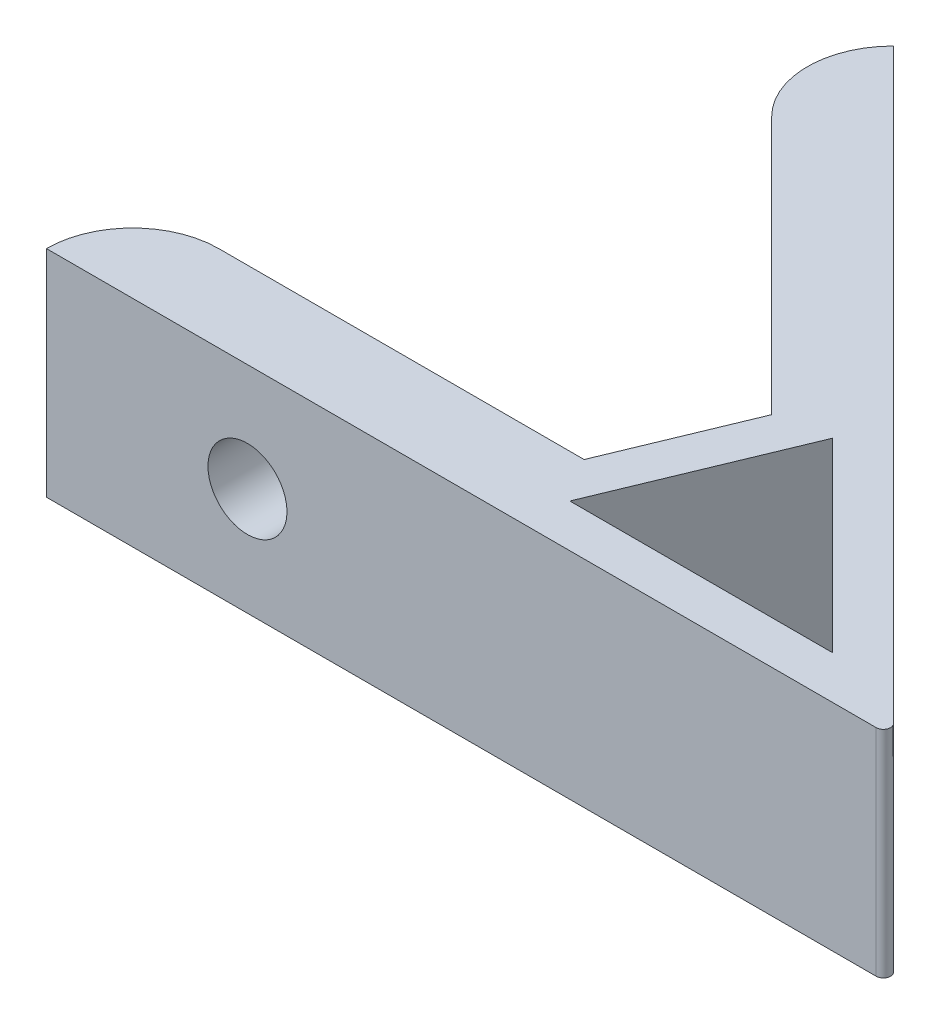
ISO-10303-21;
HEADER;
FILE_DESCRIPTION(('STEP AP214'),'2;1');
FILE_NAME('part.step','',(''),(''),'','','');
FILE_SCHEMA(('AUTOMOTIVE_DESIGN { 1 0 10303 214 1 1 1 1 }'));
ENDSEC;
DATA;
#1=APPLICATION_CONTEXT('core data for automotive mechanical design processes');
#2=APPLICATION_PROTOCOL_DEFINITION('international standard','automotive_design',2000,#1);
#3=PRODUCT_CONTEXT('',#1,'mechanical');
#4=PRODUCT('Part','Part','',(#3));
#5=PRODUCT_RELATED_PRODUCT_CATEGORY('part','',(#4));
#6=PRODUCT_DEFINITION_FORMATION('','',#4);
#7=PRODUCT_DEFINITION_CONTEXT('part definition',#1,'design');
#8=PRODUCT_DEFINITION('design','',#6,#7);
#9=PRODUCT_DEFINITION_SHAPE('','',#8);
#10=(LENGTH_UNIT() NAMED_UNIT(*) SI_UNIT(.MILLI.,.METRE.));
#11=(NAMED_UNIT(*) PLANE_ANGLE_UNIT() SI_UNIT($,.RADIAN.));
#12=(NAMED_UNIT(*) SI_UNIT($,.STERADIAN.) SOLID_ANGLE_UNIT());
#13=UNCERTAINTY_MEASURE_WITH_UNIT(LENGTH_MEASURE(1.E-05),#10,'distance_accuracy_value','');
#14=(GEOMETRIC_REPRESENTATION_CONTEXT(3) GLOBAL_UNCERTAINTY_ASSIGNED_CONTEXT((#13)) GLOBAL_UNIT_ASSIGNED_CONTEXT((#10,
#11,#12)) REPRESENTATION_CONTEXT('',''));
#15=CARTESIAN_POINT('',(0.,0.,0.));
#16=DIRECTION('',(0.,0.,1.));
#17=DIRECTION('',(1.,0.,0.));
#18=AXIS2_PLACEMENT_3D('',#15,#16,#17);
#19=CARTESIAN_POINT('',(0.,15.,0.));
#20=DIRECTION('',(-0.707106781186549,0.,0.707106781186546));
#21=DIRECTION('',(0.707106781186546,0.,0.707106781186549));
#22=AXIS2_PLACEMENT_3D('',#19,#20,#21);
#23=PLANE('',#22);
#24=CARTESIAN_POINT('',(-31.8198051533946,7.5,-31.8198051533947));
#25=DIRECTION('',(-0.707106781186549,0.,0.707106781186546));
#26=DIRECTION('',(0.707106781186546,0.,0.707106781186549));
#27=AXIS2_PLACEMENT_3D('',#24,#25,#26);
#28=CIRCLE('',#27,2.75);
#29=CARTESIAN_POINT('',(-29.8752615051316,7.5,-29.8752615051317));
#30=VERTEX_POINT('',#29);
#31=EDGE_CURVE('E438',#30,#30,#28,.T.);
#32=ORIENTED_EDGE('',*,*,#31,.T.);
#33=EDGE_LOOP('',(#32));
#34=FACE_BOUND('',#33,.T.);
#35=DIRECTION('',(-0.707106781186546,0.,-0.707106781186549));
#36=VECTOR('',#35,1.);
#37=CARTESIAN_POINT('',(0.,15.,0.));
#38=LINE('',#37,#36);
#39=CARTESIAN_POINT('',(-0.853553390593271,15.,-0.853553390593273));
#40=VERTEX_POINT('',#39);
#41=CARTESIAN_POINT('',(-41.7193000900062,15.,-41.7193000900064));
#42=VERTEX_POINT('',#41);
#43=EDGE_CURVE('E153',#40,#42,#38,.T.);
#44=ORIENTED_EDGE('',*,*,#43,.F.);
#45=DIRECTION('',(0.,-1.,0.));
#46=VECTOR('',#45,1.);
#47=CARTESIAN_POINT('',(-0.853553390593271,15.,-0.853553390593273));
#48=LINE('',#47,#46);
#49=CARTESIAN_POINT('',(-0.853553390593271,0.,-0.853553390593273));
#50=VERTEX_POINT('',#49);
#51=EDGE_CURVE('E202',#40,#50,#48,.T.);
#52=ORIENTED_EDGE('',*,*,#51,.T.);
#53=DIRECTION('',(-0.707106781186546,0.,-0.707106781186549));
#54=VECTOR('',#53,1.);
#55=CARTESIAN_POINT('',(0.,0.,0.));
#56=LINE('',#55,#54);
#57=CARTESIAN_POINT('',(-41.7193000900062,0.,-41.7193000900064));
#58=VERTEX_POINT('',#57);
#59=EDGE_CURVE('E151',#50,#58,#56,.T.);
#60=ORIENTED_EDGE('',*,*,#59,.T.);
#61=DIRECTION('',(0.,-1.,0.));
#62=VECTOR('',#61,1.);
#63=CARTESIAN_POINT('',(-41.7193000900062,15.,-41.7193000900064));
#64=LINE('',#63,#62);
#65=EDGE_CURVE('E185',#42,#58,#64,.T.);
#66=ORIENTED_EDGE('',*,*,#65,.F.);
#67=EDGE_LOOP('',(#44,#52,#60,#66));
#68=FACE_BOUND('',#67,.T.);
#69=ADVANCED_FACE('F39',(#34,#68),#23,.F.);
#70=CARTESIAN_POINT('',(-45.9619407771255,15.,-37.4766594028871));
#71=DIRECTION('',(0.707106781186549,0.,-0.707106781186546));
#72=DIRECTION('',(-0.707106781186546,0.,-0.707106781186549));
#73=AXIS2_PLACEMENT_3D('',#70,#71,#72);
#74=PLANE('',#73);
#75=CARTESIAN_POINT('',(-36.0624458405139,7.5,-27.5771644662754));
#76=DIRECTION('',(-0.707106781186549,0.,0.707106781186546));
#77=DIRECTION('',(0.707106781186546,0.,0.707106781186549));
#78=AXIS2_PLACEMENT_3D('',#75,#76,#77);
#79=CIRCLE('',#78,2.75);
#80=CARTESIAN_POINT('',(-34.1179021922509,7.5,-25.6326208180124));
#81=VERTEX_POINT('',#80);
#82=EDGE_CURVE('E436',#81,#81,#79,.T.);
#83=ORIENTED_EDGE('',*,*,#82,.F.);
#84=EDGE_LOOP('',(#83));
#85=FACE_BOUND('',#84,.T.);
#86=DIRECTION('',(0.707106781186546,0.,0.707106781186549));
#87=VECTOR('',#86,1.);
#88=CARTESIAN_POINT('',(-45.9619407771255,15.,-37.4766594028871));
#89=LINE('',#88,#87);
#90=CARTESIAN_POINT('',(-41.7193000900062,15.,-33.2340187157678));
#91=VERTEX_POINT('',#90);
#92=CARTESIAN_POINT('',(-23.7240766993514,15.,-15.2387953251129));
#93=VERTEX_POINT('',#92);
#94=EDGE_CURVE('E155',#91,#93,#89,.T.);
#95=ORIENTED_EDGE('',*,*,#94,.F.);
#96=DIRECTION('',(0.,-1.,0.));
#97=VECTOR('',#96,1.);
#98=CARTESIAN_POINT('',(-41.7193000900062,15.,-33.2340187157678));
#99=LINE('',#98,#97);
#100=CARTESIAN_POINT('',(-41.7193000900062,0.,-33.2340187157678));
#101=VERTEX_POINT('',#100);
#102=EDGE_CURVE('E188',#91,#101,#99,.T.);
#103=ORIENTED_EDGE('',*,*,#102,.T.);
#104=DIRECTION('',(0.707106781186546,0.,0.707106781186549));
#105=VECTOR('',#104,1.);
#106=CARTESIAN_POINT('',(-45.9619407771255,0.,-37.4766594028871));
#107=LINE('',#106,#105);
#108=CARTESIAN_POINT('',(-23.7240766993514,0.,-15.2387953251129));
#109=VERTEX_POINT('',#108);
#110=EDGE_CURVE('E168',#101,#109,#107,.T.);
#111=ORIENTED_EDGE('',*,*,#110,.T.);
#112=DIRECTION('',(0.,-1.,0.));
#113=VECTOR('',#112,1.);
#114=CARTESIAN_POINT('',(-23.7240766993514,15.,-15.2387953251129));
#115=LINE('',#114,#113);
#116=EDGE_CURVE('E182',#93,#109,#115,.T.);
#117=ORIENTED_EDGE('',*,*,#116,.F.);
#118=EDGE_LOOP('',(#95,#103,#111,#117));
#119=FACE_BOUND('',#118,.T.);
#120=ADVANCED_FACE('F231',(#85,#119),#74,.F.);
#121=CARTESIAN_POINT('',(-23.7240766993514,15.,-15.2387953251129));
#122=DIRECTION('',(0.92387953251129,0.,0.382683432365081));
#123=DIRECTION('',(0.382683432365081,0.,-0.92387953251129));
#124=AXIS2_PLACEMENT_3D('',#121,#122,#123);
#125=PLANE('',#124);
#126=DIRECTION('',(-0.382683432365081,0.,0.92387953251129));
#127=VECTOR('',#126,1.);
#128=CARTESIAN_POINT('',(-23.7240766993514,0.,-15.2387953251129));
#129=LINE('',#128,#127);
#130=CARTESIAN_POINT('',(-27.5509110230022,0.,-6.));
#131=VERTEX_POINT('',#130);
#132=EDGE_CURVE('E170',#109,#131,#129,.T.);
#133=ORIENTED_EDGE('',*,*,#132,.T.);
#134=DIRECTION('',(0.,-1.,0.));
#135=VECTOR('',#134,1.);
#136=CARTESIAN_POINT('',(-27.5509110230022,15.,-6.));
#137=LINE('',#136,#135);
#138=CARTESIAN_POINT('',(-27.5509110230022,15.,-6.));
#139=VERTEX_POINT('',#138);
#140=EDGE_CURVE('E179',#139,#131,#137,.T.);
#141=ORIENTED_EDGE('',*,*,#140,.F.);
#142=DIRECTION('',(-0.382683432365081,0.,0.92387953251129));
#143=VECTOR('',#142,1.);
#144=CARTESIAN_POINT('',(-23.7240766993514,15.,-15.2387953251129));
#145=LINE('',#144,#143);
#146=EDGE_CURVE('E158',#93,#139,#145,.T.);
#147=ORIENTED_EDGE('',*,*,#146,.F.);
#148=ORIENTED_EDGE('',*,*,#116,.T.);
#149=EDGE_LOOP('',(#133,#141,#147,#148));
#150=FACE_BOUND('',#149,.T.);
#151=ADVANCED_FACE('F235',(#150),#125,.F.);
#152=CARTESIAN_POINT('',(-27.5509110230022,15.,-6.));
#153=DIRECTION('',(0.,0.,1.));
#154=DIRECTION('',(1.,0.,0.));
#155=AXIS2_PLACEMENT_3D('',#152,#153,#154);
#156=PLANE('',#155);
#157=CARTESIAN_POINT('',(-45.,7.5,-5.99999999999999));
#158=DIRECTION('',(0.,0.,-1.));
#159=DIRECTION('',(-1.,0.,0.));
#160=AXIS2_PLACEMENT_3D('',#157,#158,#159);
#161=CIRCLE('',#160,2.75);
#162=CARTESIAN_POINT('',(-47.75,7.5,-5.99999999999999));
#163=VERTEX_POINT('',#162);
#164=EDGE_CURVE('E142',#163,#163,#161,.T.);
#165=ORIENTED_EDGE('',*,*,#164,.F.);
#166=EDGE_LOOP('',(#165));
#167=FACE_BOUND('',#166,.T.);
#168=DIRECTION('',(-1.,0.,0.));
#169=VECTOR('',#168,1.);
#170=CARTESIAN_POINT('',(-27.5509110230022,0.,-6.));
#171=LINE('',#170,#169);
#172=CARTESIAN_POINT('',(-53.,0.,-5.99999999999999));
#173=VERTEX_POINT('',#172);
#174=EDGE_CURVE('E172',#131,#173,#171,.T.);
#175=ORIENTED_EDGE('',*,*,#174,.T.);
#176=DIRECTION('',(0.,-1.,0.));
#177=VECTOR('',#176,1.);
#178=CARTESIAN_POINT('',(-53.,15.,-5.99999999999999));
#179=LINE('',#178,#177);
#180=CARTESIAN_POINT('',(-53.,15.,-5.99999999999999));
#181=VERTEX_POINT('',#180);
#182=EDGE_CURVE('E200',#173,#181,#179,.F.);
#183=ORIENTED_EDGE('',*,*,#182,.T.);
#184=DIRECTION('',(-1.,0.,0.));
#185=VECTOR('',#184,1.);
#186=CARTESIAN_POINT('',(-27.5509110230022,15.,-6.));
#187=LINE('',#186,#185);
#188=EDGE_CURVE('E160',#139,#181,#187,.T.);
#189=ORIENTED_EDGE('',*,*,#188,.F.);
#190=ORIENTED_EDGE('',*,*,#140,.T.);
#191=EDGE_LOOP('',(#175,#183,#189,#190));
#192=FACE_BOUND('',#191,.T.);
#193=ADVANCED_FACE('F242',(#167,#192),#156,.F.);
#194=CARTESIAN_POINT('',(0.,15.,0.));
#195=DIRECTION('',(0.,0.,-1.));
#196=DIRECTION('',(-1.,0.,0.));
#197=AXIS2_PLACEMENT_3D('',#194,#195,#196);
#198=PLANE('',#197);
#199=CARTESIAN_POINT('',(-45.,7.5,0.));
#200=DIRECTION('',(0.,0.,-1.));
#201=DIRECTION('',(-1.,0.,0.));
#202=AXIS2_PLACEMENT_3D('',#199,#200,#201);
#203=CIRCLE('',#202,2.75);
#204=CARTESIAN_POINT('',(-47.75,7.5,0.));
#205=VERTEX_POINT('',#204);
#206=EDGE_CURVE('E147',#205,#205,#203,.T.);
#207=ORIENTED_EDGE('',*,*,#206,.T.);
#208=EDGE_LOOP('',(#207));
#209=FACE_BOUND('',#208,.T.);
#210=DIRECTION('',(1.,0.,0.));
#211=VECTOR('',#210,1.);
#212=CARTESIAN_POINT('',(0.,0.,0.));
#213=LINE('',#212,#211);
#214=CARTESIAN_POINT('',(-59.,0.,0.));
#215=VERTEX_POINT('',#214);
#216=CARTESIAN_POINT('',(-1.20710678118655,0.,0.));
#217=VERTEX_POINT('',#216);
#218=EDGE_CURVE('E156',#215,#217,#213,.T.);
#219=ORIENTED_EDGE('',*,*,#218,.T.);
#220=DIRECTION('',(0.,-1.,0.));
#221=VECTOR('',#220,1.);
#222=CARTESIAN_POINT('',(-1.20710678118655,15.,0.));
#223=LINE('',#222,#221);
#224=CARTESIAN_POINT('',(-1.20710678118655,15.,0.));
#225=VERTEX_POINT('',#224);
#226=EDGE_CURVE('E47',#217,#225,#223,.F.);
#227=ORIENTED_EDGE('',*,*,#226,.T.);
#228=DIRECTION('',(1.,0.,0.));
#229=VECTOR('',#228,1.);
#230=CARTESIAN_POINT('',(0.,15.,0.));
#231=LINE('',#230,#229);
#232=CARTESIAN_POINT('',(-59.,15.,0.));
#233=VERTEX_POINT('',#232);
#234=EDGE_CURVE('E163',#233,#225,#231,.T.);
#235=ORIENTED_EDGE('',*,*,#234,.F.);
#236=DIRECTION('',(0.,-1.,0.));
#237=VECTOR('',#236,1.);
#238=CARTESIAN_POINT('',(-59.,15.,0.));
#239=LINE('',#238,#237);
#240=EDGE_CURVE('E166',#233,#215,#239,.T.);
#241=ORIENTED_EDGE('',*,*,#240,.T.);
#242=EDGE_LOOP('',(#219,#227,#235,#241));
#243=FACE_BOUND('',#242,.T.);
#244=ADVANCED_FACE('F209',(#209,#243),#198,.F.);
#245=CARTESIAN_POINT('',(0.,15.,0.));
#246=DIRECTION('',(0.,1.,0.));
#247=DIRECTION('',(0.,0.,1.));
#248=AXIS2_PLACEMENT_3D('',#245,#246,#247);
#249=PLANE('',#248);
#250=DIRECTION('',(-0.382683432365081,0.,0.92387953251129));
#251=VECTOR('',#250,1.);
#252=CARTESIAN_POINT('',(-25.5463751092443,15.,-3.));
#253=LINE('',#252,#251);
#254=CARTESIAN_POINT('',(-20.1853354180416,15.,-15.9426947309223));
#255=VERTEX_POINT('',#254);
#256=CARTESIAN_POINT('',(-25.5463751092443,15.,-3.));
#257=VERTEX_POINT('',#256);
#258=EDGE_CURVE('E54',#255,#257,#253,.T.);
#259=ORIENTED_EDGE('',*,*,#258,.F.);
#260=DIRECTION('',(-0.707106781186548,0.,-0.707106781186547));
#261=VECTOR('',#260,1.);
#262=CARTESIAN_POINT('',(-20.1853354180416,15.,-15.9426947309223));
#263=LINE('',#262,#261);
#264=CARTESIAN_POINT('',(-7.24264068711928,15.,-3.));
#265=VERTEX_POINT('',#264);
#266=EDGE_CURVE('E136',#265,#255,#263,.T.);
#267=ORIENTED_EDGE('',*,*,#266,.F.);
#268=DIRECTION('',(1.,0.,0.));
#269=VECTOR('',#268,1.);
#270=CARTESIAN_POINT('',(-7.24264068711928,15.,-3.));
#271=LINE('',#270,#269);
#272=EDGE_CURVE('E139',#257,#265,#271,.T.);
#273=ORIENTED_EDGE('',*,*,#272,.F.);
#274=EDGE_LOOP('',(#259,#267,#273));
#275=FACE_BOUND('',#274,.T.);
#276=ORIENTED_EDGE('',*,*,#234,.T.);
#277=CARTESIAN_POINT('',(-1.20710678118655,15.,-0.5));
#278=DIRECTION('',(0.,1.,0.));
#279=DIRECTION('',(0.,0.,1.));
#280=AXIS2_PLACEMENT_3D('',#277,#278,#279);
#281=CIRCLE('',#280,0.5);
#282=EDGE_CURVE('E11',#225,#40,#281,.T.);
#283=ORIENTED_EDGE('',*,*,#282,.T.);
#284=ORIENTED_EDGE('',*,*,#43,.T.);
#285=CARTESIAN_POINT('',(-37.476659402887,15.,-37.4766594028871));
#286=DIRECTION('',(0.,1.,0.));
#287=DIRECTION('',(0.,0.,1.));
#288=AXIS2_PLACEMENT_3D('',#285,#286,#287);
#289=CIRCLE('',#288,6.);
#290=EDGE_CURVE('E198',#42,#91,#289,.T.);
#291=ORIENTED_EDGE('',*,*,#290,.T.);
#292=ORIENTED_EDGE('',*,*,#94,.T.);
#293=ORIENTED_EDGE('',*,*,#146,.T.);
#294=ORIENTED_EDGE('',*,*,#188,.T.);
#295=CARTESIAN_POINT('',(-53.,15.,0.));
#296=DIRECTION('',(0.,1.,0.));
#297=DIRECTION('',(0.,0.,1.));
#298=AXIS2_PLACEMENT_3D('',#295,#296,#297);
#299=CIRCLE('',#298,6.);
#300=EDGE_CURVE('E196',#181,#233,#299,.T.);
#301=ORIENTED_EDGE('',*,*,#300,.T.);
#302=EDGE_LOOP('',(#276,#283,#284,#291,#292,#293,#294,#301));
#303=FACE_BOUND('',#302,.T.);
#304=ADVANCED_FACE('F215',(#275,#303),#249,.T.);
#305=CARTESIAN_POINT('',(0.,0.,0.));
#306=DIRECTION('',(0.,1.,0.));
#307=DIRECTION('',(0.,0.,1.));
#308=AXIS2_PLACEMENT_3D('',#305,#306,#307);
#309=PLANE('',#308);
#310=DIRECTION('',(-0.707106781186548,0.,-0.707106781186547));
#311=VECTOR('',#310,1.);
#312=CARTESIAN_POINT('',(-20.1853354180416,0.,-15.9426947309223));
#313=LINE('',#312,#311);
#314=CARTESIAN_POINT('',(-7.24264068711928,0.,-3.));
#315=VERTEX_POINT('',#314);
#316=CARTESIAN_POINT('',(-20.1853354180416,0.,-15.9426947309223));
#317=VERTEX_POINT('',#316);
#318=EDGE_CURVE('E62',#315,#317,#313,.T.);
#319=ORIENTED_EDGE('',*,*,#318,.T.);
#320=DIRECTION('',(-0.382683432365081,0.,0.92387953251129));
#321=VECTOR('',#320,1.);
#322=CARTESIAN_POINT('',(-25.5463751092443,0.,-3.));
#323=LINE('',#322,#321);
#324=CARTESIAN_POINT('',(-25.5463751092443,0.,-3.));
#325=VERTEX_POINT('',#324);
#326=EDGE_CURVE('E123',#317,#325,#323,.T.);
#327=ORIENTED_EDGE('',*,*,#326,.T.);
#328=DIRECTION('',(1.,0.,0.));
#329=VECTOR('',#328,1.);
#330=CARTESIAN_POINT('',(-7.24264068711928,0.,-3.));
#331=LINE('',#330,#329);
#332=EDGE_CURVE('E130',#325,#315,#331,.T.);
#333=ORIENTED_EDGE('',*,*,#332,.T.);
#334=EDGE_LOOP('',(#319,#327,#333));
#335=FACE_BOUND('',#334,.T.);
#336=ORIENTED_EDGE('',*,*,#59,.F.);
#337=CARTESIAN_POINT('',(-1.20710678118655,0.,-0.5));
#338=DIRECTION('',(0.,1.,0.));
#339=DIRECTION('',(0.,0.,1.));
#340=AXIS2_PLACEMENT_3D('',#337,#338,#339);
#341=CIRCLE('',#340,0.5);
#342=EDGE_CURVE('E205',#50,#217,#341,.F.);
#343=ORIENTED_EDGE('',*,*,#342,.T.);
#344=ORIENTED_EDGE('',*,*,#218,.F.);
#345=CARTESIAN_POINT('',(-53.,0.,0.));
#346=DIRECTION('',(0.,1.,0.));
#347=DIRECTION('',(0.,0.,1.));
#348=AXIS2_PLACEMENT_3D('',#345,#346,#347);
#349=CIRCLE('',#348,6.);
#350=EDGE_CURVE('E191',#215,#173,#349,.F.);
#351=ORIENTED_EDGE('',*,*,#350,.T.);
#352=ORIENTED_EDGE('',*,*,#174,.F.);
#353=ORIENTED_EDGE('',*,*,#132,.F.);
#354=ORIENTED_EDGE('',*,*,#110,.F.);
#355=CARTESIAN_POINT('',(-37.476659402887,0.,-37.4766594028871));
#356=DIRECTION('',(0.,1.,0.));
#357=DIRECTION('',(0.,0.,1.));
#358=AXIS2_PLACEMENT_3D('',#355,#356,#357);
#359=CIRCLE('',#358,6.);
#360=EDGE_CURVE('E193',#101,#58,#359,.F.);
#361=ORIENTED_EDGE('',*,*,#360,.T.);
#362=EDGE_LOOP('',(#336,#343,#344,#351,#352,#353,#354,#361));
#363=FACE_BOUND('',#362,.T.);
#364=ADVANCED_FACE('F134',(#335,#363),#309,.F.);
#365=CARTESIAN_POINT('',(-37.476659402887,15.,-37.4766594028871));
#366=DIRECTION('',(0.,-1.,0.));
#367=DIRECTION('',(0.,0.,-1.));
#368=AXIS2_PLACEMENT_3D('',#365,#366,#367);
#369=CYLINDRICAL_SURFACE('',#368,6.);
#370=ORIENTED_EDGE('',*,*,#290,.F.);
#371=ORIENTED_EDGE('',*,*,#65,.T.);
#372=ORIENTED_EDGE('',*,*,#360,.F.);
#373=ORIENTED_EDGE('',*,*,#102,.F.);
#374=EDGE_LOOP('',(#370,#371,#372,#373));
#375=FACE_BOUND('',#374,.T.);
#376=ADVANCED_FACE('F227',(#375),#369,.T.);
#377=CARTESIAN_POINT('',(-53.,15.,0.));
#378=DIRECTION('',(0.,-1.,0.));
#379=DIRECTION('',(0.,0.,-1.));
#380=AXIS2_PLACEMENT_3D('',#377,#378,#379);
#381=CYLINDRICAL_SURFACE('',#380,6.);
#382=ORIENTED_EDGE('',*,*,#300,.F.);
#383=ORIENTED_EDGE('',*,*,#182,.F.);
#384=ORIENTED_EDGE('',*,*,#350,.F.);
#385=ORIENTED_EDGE('',*,*,#240,.F.);
#386=EDGE_LOOP('',(#382,#383,#384,#385));
#387=FACE_BOUND('',#386,.T.);
#388=ADVANCED_FACE('F240',(#387),#381,.T.);
#389=CARTESIAN_POINT('',(-1.20710678118655,15.,-0.5));
#390=DIRECTION('',(0.,-1.,0.));
#391=DIRECTION('',(0.,0.,-1.));
#392=AXIS2_PLACEMENT_3D('',#389,#390,#391);
#393=CYLINDRICAL_SURFACE('',#392,0.5);
#394=ORIENTED_EDGE('',*,*,#282,.F.);
#395=ORIENTED_EDGE('',*,*,#226,.F.);
#396=ORIENTED_EDGE('',*,*,#342,.F.);
#397=ORIENTED_EDGE('',*,*,#51,.F.);
#398=EDGE_LOOP('',(#394,#395,#396,#397));
#399=FACE_BOUND('',#398,.T.);
#400=ADVANCED_FACE('F41',(#399),#393,.T.);
#401=CARTESIAN_POINT('',(-25.5463751092443,0.,-3.));
#402=DIRECTION('',(-0.92387953251129,0.,-0.382683432365081));
#403=DIRECTION('',(-0.382683432365081,0.,0.92387953251129));
#404=AXIS2_PLACEMENT_3D('',#401,#402,#403);
#405=PLANE('',#404);
#406=ORIENTED_EDGE('',*,*,#258,.T.);
#407=DIRECTION('',(0.,1.,0.));
#408=VECTOR('',#407,1.);
#409=CARTESIAN_POINT('',(-25.5463751092443,0.,-3.));
#410=LINE('',#409,#408);
#411=EDGE_CURVE('E119',#325,#257,#410,.T.);
#412=ORIENTED_EDGE('',*,*,#411,.F.);
#413=ORIENTED_EDGE('',*,*,#326,.F.);
#414=DIRECTION('',(0.,1.,0.));
#415=VECTOR('',#414,1.);
#416=CARTESIAN_POINT('',(-20.1853354180416,0.,-15.9426947309223));
#417=LINE('',#416,#415);
#418=EDGE_CURVE('E149',#317,#255,#417,.T.);
#419=ORIENTED_EDGE('',*,*,#418,.T.);
#420=EDGE_LOOP('',(#406,#412,#413,#419));
#421=FACE_BOUND('',#420,.T.);
#422=ADVANCED_FACE('F121',(#421),#405,.F.);
#423=CARTESIAN_POINT('',(-20.1853354180416,0.,-15.9426947309223));
#424=DIRECTION('',(0.707106781186547,0.,-0.707106781186548));
#425=DIRECTION('',(-0.707106781186548,0.,-0.707106781186547));
#426=AXIS2_PLACEMENT_3D('',#423,#424,#425);
#427=PLANE('',#426);
#428=ORIENTED_EDGE('',*,*,#266,.T.);
#429=ORIENTED_EDGE('',*,*,#418,.F.);
#430=ORIENTED_EDGE('',*,*,#318,.F.);
#431=DIRECTION('',(0.,1.,0.));
#432=VECTOR('',#431,1.);
#433=CARTESIAN_POINT('',(-7.24264068711928,0.,-3.));
#434=LINE('',#433,#432);
#435=EDGE_CURVE('E127',#315,#265,#434,.T.);
#436=ORIENTED_EDGE('',*,*,#435,.T.);
#437=EDGE_LOOP('',(#428,#429,#430,#436));
#438=FACE_BOUND('',#437,.T.);
#439=ADVANCED_FACE('F272',(#438),#427,.F.);
#440=CARTESIAN_POINT('',(-7.24264068711928,0.,-3.));
#441=DIRECTION('',(0.,0.,1.));
#442=DIRECTION('',(1.,0.,0.));
#443=AXIS2_PLACEMENT_3D('',#440,#441,#442);
#444=PLANE('',#443);
#445=ORIENTED_EDGE('',*,*,#272,.T.);
#446=ORIENTED_EDGE('',*,*,#435,.F.);
#447=ORIENTED_EDGE('',*,*,#332,.F.);
#448=ORIENTED_EDGE('',*,*,#411,.T.);
#449=EDGE_LOOP('',(#445,#446,#447,#448));
#450=FACE_BOUND('',#449,.T.);
#451=ADVANCED_FACE('F131',(#450),#444,.F.);
#452=CARTESIAN_POINT('',(-45.,7.5,0.));
#453=DIRECTION('',(0.,0.,-1.));
#454=DIRECTION('',(-1.,0.,0.));
#455=AXIS2_PLACEMENT_3D('',#452,#453,#454);
#456=CYLINDRICAL_SURFACE('',#455,2.75);
#457=CARTESIAN_POINT('',(-47.75,7.5,0.));
#458=CARTESIAN_POINT('',(-47.75,7.5,-0.0624999999999935));
#459=CARTESIAN_POINT('',(-47.75,7.5,-0.124999999999994));
#460=CARTESIAN_POINT('',(-47.75,7.5,-0.249999999999994));
#461=CARTESIAN_POINT('',(-47.75,7.5,-0.312499999999994));
#462=CARTESIAN_POINT('',(-47.75,7.5,-0.437499999999994));
#463=CARTESIAN_POINT('',(-47.75,7.5,-0.499999999999994));
#464=CARTESIAN_POINT('',(-47.75,7.5,-0.624999999999994));
#465=CARTESIAN_POINT('',(-47.75,7.5,-0.687499999999994));
#466=CARTESIAN_POINT('',(-47.75,7.5,-0.812499999999994));
#467=CARTESIAN_POINT('',(-47.75,7.5,-0.874999999999994));
#468=CARTESIAN_POINT('',(-47.75,7.5,-0.999999999999994));
#469=CARTESIAN_POINT('',(-47.75,7.5,-1.06249999999999));
#470=CARTESIAN_POINT('',(-47.75,7.5,-1.18749999999999));
#471=CARTESIAN_POINT('',(-47.75,7.5,-1.24999999999999));
#472=CARTESIAN_POINT('',(-47.75,7.5,-1.37499999999999));
#473=CARTESIAN_POINT('',(-47.75,7.5,-1.43749999999999));
#474=CARTESIAN_POINT('',(-47.75,7.5,-1.56249999999999));
#475=CARTESIAN_POINT('',(-47.75,7.5,-1.62499999999999));
#476=CARTESIAN_POINT('',(-47.75,7.5,-1.74999999999999));
#477=CARTESIAN_POINT('',(-47.75,7.5,-1.81249999999999));
#478=CARTESIAN_POINT('',(-47.75,7.5,-1.93749999999999));
#479=CARTESIAN_POINT('',(-47.75,7.5,-1.99999999999999));
#480=CARTESIAN_POINT('',(-47.75,7.5,-2.12499999999999));
#481=CARTESIAN_POINT('',(-47.75,7.5,-2.18749999999999));
#482=CARTESIAN_POINT('',(-47.75,7.5,-2.31249999999999));
#483=CARTESIAN_POINT('',(-47.75,7.5,-2.37499999999999));
#484=CARTESIAN_POINT('',(-47.75,7.5,-2.49999999999999));
#485=CARTESIAN_POINT('',(-47.75,7.5,-2.56249999999999));
#486=CARTESIAN_POINT('',(-47.75,7.5,-2.68749999999999));
#487=CARTESIAN_POINT('',(-47.75,7.5,-2.74999999999999));
#488=CARTESIAN_POINT('',(-47.75,7.5,-2.87499999999999));
#489=CARTESIAN_POINT('',(-47.75,7.5,-2.93749999999999));
#490=CARTESIAN_POINT('',(-47.75,7.5,-3.06249999999999));
#491=CARTESIAN_POINT('',(-47.75,7.5,-3.12499999999999));
#492=CARTESIAN_POINT('',(-47.75,7.5,-3.24999999999999));
#493=CARTESIAN_POINT('',(-47.75,7.5,-3.31249999999999));
#494=CARTESIAN_POINT('',(-47.75,7.5,-3.43749999999999));
#495=CARTESIAN_POINT('',(-47.75,7.5,-3.49999999999999));
#496=CARTESIAN_POINT('',(-47.75,7.5,-3.62499999999999));
#497=CARTESIAN_POINT('',(-47.75,7.5,-3.68749999999999));
#498=CARTESIAN_POINT('',(-47.75,7.5,-3.81249999999999));
#499=CARTESIAN_POINT('',(-47.75,7.5,-3.87499999999999));
#500=CARTESIAN_POINT('',(-47.75,7.5,-3.99999999999999));
#501=CARTESIAN_POINT('',(-47.75,7.5,-4.06249999999999));
#502=CARTESIAN_POINT('',(-47.75,7.5,-4.18749999999999));
#503=CARTESIAN_POINT('',(-47.75,7.5,-4.24999999999999));
#504=CARTESIAN_POINT('',(-47.75,7.5,-4.37499999999999));
#505=CARTESIAN_POINT('',(-47.75,7.5,-4.43749999999999));
#506=CARTESIAN_POINT('',(-47.75,7.5,-4.56249999999999));
#507=CARTESIAN_POINT('',(-47.75,7.5,-4.62499999999999));
#508=CARTESIAN_POINT('',(-47.75,7.5,-4.74999999999999));
#509=CARTESIAN_POINT('',(-47.75,7.5,-4.81249999999999));
#510=CARTESIAN_POINT('',(-47.75,7.5,-4.93749999999999));
#511=CARTESIAN_POINT('',(-47.75,7.5,-4.99999999999999));
#512=CARTESIAN_POINT('',(-47.75,7.5,-5.12499999999999));
#513=CARTESIAN_POINT('',(-47.75,7.5,-5.18749999999999));
#514=CARTESIAN_POINT('',(-47.75,7.5,-5.31249999999999));
#515=CARTESIAN_POINT('',(-47.75,7.5,-5.37499999999999));
#516=CARTESIAN_POINT('',(-47.75,7.5,-5.49999999999999));
#517=CARTESIAN_POINT('',(-47.75,7.5,-5.56249999999999));
#518=CARTESIAN_POINT('',(-47.75,7.5,-5.68749999999999));
#519=CARTESIAN_POINT('',(-47.75,7.5,-5.74999999999999));
#520=CARTESIAN_POINT('',(-47.75,7.5,-5.87499999999999));
#521=CARTESIAN_POINT('',(-47.75,7.5,-5.93749999999999));
#522=CARTESIAN_POINT('',(-47.75,7.5,-5.99999999999999));
#523=B_SPLINE_CURVE_WITH_KNOTS('',3,(#457,#458,#459,#460,#461,#462,#463,#464,#465,#466,#467,
#468,#469,#470,#471,#472,#473,#474,#475,#476,#477,#478,#479,#480,#481,#482,#483,#484,#485,#486,
#487,#488,#489,#490,#491,#492,#493,#494,#495,#496,#497,#498,#499,#500,#501,#502,#503,#504,#505,
#506,#507,#508,#509,#510,#511,#512,#513,#514,#515,#516,#517,#518,#519,#520,#521,#522),
.UNSPECIFIED.,.F.,.F.,(4,2,2,2,2,2,2,2,2,2,2,2,2,2,2,2,2,2,2,2,2,2,2,2,2,2,2,2,2,2,2,2,4),(0.,
0.1875,0.375,0.5625,0.75,0.9375,1.125,1.3125,1.5,1.6875,1.875,2.0625,2.25,2.4375,2.625,2.8125,
3.,3.1875,3.375,3.5625,3.75,3.9375,4.125,4.3125,4.5,4.6875,4.875,5.0625,5.25,5.4375,5.625,
5.8125,6.),.UNSPECIFIED.);
#524=EDGE_CURVE('BSEAM321',#205,#163,#523,.T.);
#525=ORIENTED_EDGE('',*,*,#206,.F.);
#526=ORIENTED_EDGE('',*,*,#164,.T.);
#527=ORIENTED_EDGE('',*,*,#524,.T.);
#528=ORIENTED_EDGE('',*,*,#524,.F.);
#529=EDGE_LOOP('',(#525,#527,#526,#528));
#530=FACE_BOUND('',#529,.T.);
#531=ADVANCED_FACE('F321',(#530),#456,.F.);
#532=CARTESIAN_POINT('',(-11.3137084989847,7.5,-52.3259018078045));
#533=DIRECTION('',(-0.707106781186549,0.,0.707106781186546));
#534=DIRECTION('',(0.707106781186546,0.,0.707106781186549));
#535=AXIS2_PLACEMENT_3D('',#532,#533,#534);
#536=CYLINDRICAL_SURFACE('',#535,2.75);
#537=ORIENTED_EDGE('',*,*,#82,.T.);
#538=EDGE_LOOP('',(#537));
#539=FACE_BOUND('',#538,.T.);
#540=ORIENTED_EDGE('',*,*,#31,.F.);
#541=EDGE_LOOP('',(#540));
#542=FACE_BOUND('',#541,.T.);
#543=ADVANCED_FACE('F330',(#539,#542),#536,.F.);
#544=CLOSED_SHELL('',(#69,#120,#151,#193,#244,#304,#364,#376,#388,#400,#422,#439,#451,#531,#543));
#545=MANIFOLD_SOLID_BREP('B2',#544);
#546=ADVANCED_BREP_SHAPE_REPRESENTATION('',(#18,#545),#14);
#547=SHAPE_DEFINITION_REPRESENTATION(#9,#546);
ENDSEC;
END-ISO-10303-21;
